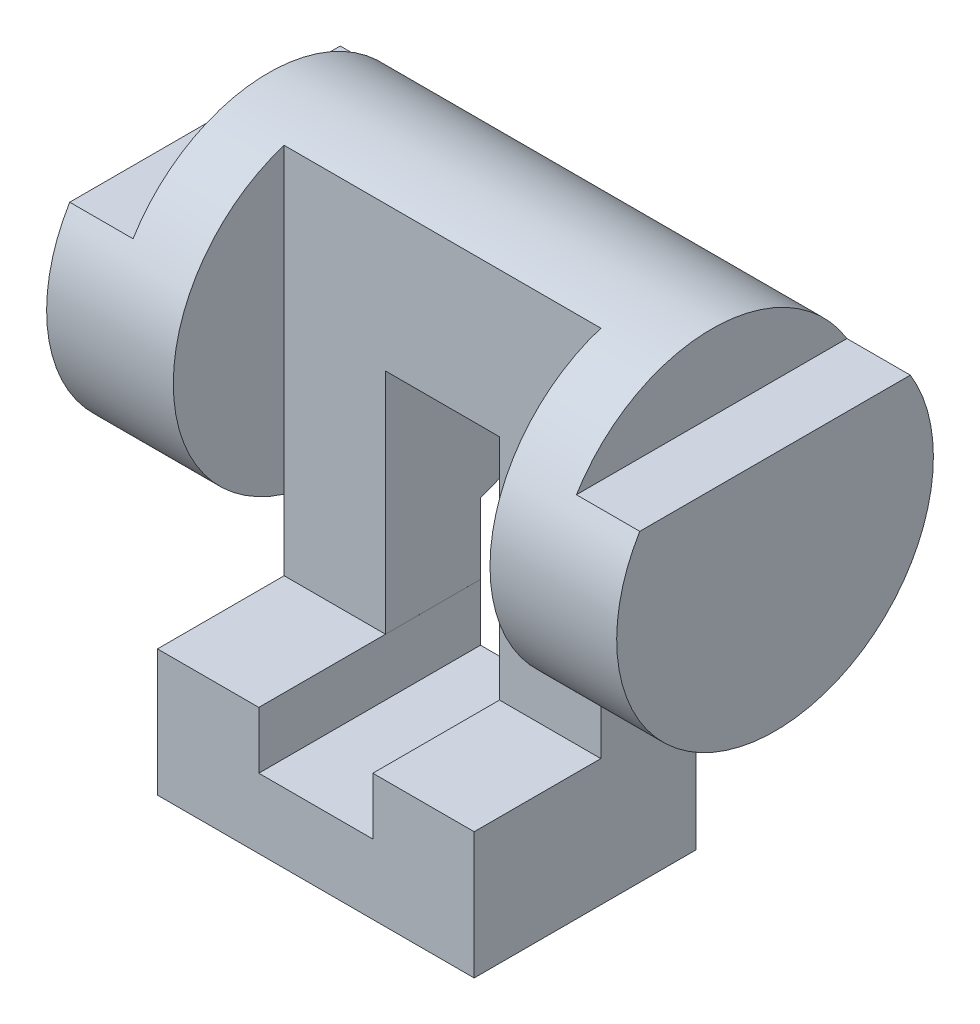
ISO-10303-21;
HEADER;
FILE_DESCRIPTION(('STEP AP214'),'2;1');
FILE_NAME('part.step','',(''),(''),'','','');
FILE_SCHEMA(('AUTOMOTIVE_DESIGN { 1 0 10303 214 1 1 1 1 }'));
ENDSEC;
DATA;
#1=APPLICATION_CONTEXT('core data for automotive mechanical design processes');
#2=APPLICATION_PROTOCOL_DEFINITION('international standard','automotive_design',2000,#1);
#3=PRODUCT_CONTEXT('',#1,'mechanical');
#4=PRODUCT('Part','Part','',(#3));
#5=PRODUCT_RELATED_PRODUCT_CATEGORY('part','',(#4));
#6=PRODUCT_DEFINITION_FORMATION('','',#4);
#7=PRODUCT_DEFINITION_CONTEXT('part definition',#1,'design');
#8=PRODUCT_DEFINITION('design','',#6,#7);
#9=PRODUCT_DEFINITION_SHAPE('','',#8);
#10=(LENGTH_UNIT() NAMED_UNIT(*) SI_UNIT(.MILLI.,.METRE.));
#11=(NAMED_UNIT(*) PLANE_ANGLE_UNIT() SI_UNIT($,.RADIAN.));
#12=(NAMED_UNIT(*) SI_UNIT($,.STERADIAN.) SOLID_ANGLE_UNIT());
#13=UNCERTAINTY_MEASURE_WITH_UNIT(LENGTH_MEASURE(1.E-05),#10,'distance_accuracy_value','');
#14=(GEOMETRIC_REPRESENTATION_CONTEXT(3) GLOBAL_UNCERTAINTY_ASSIGNED_CONTEXT((#13)) GLOBAL_UNIT_ASSIGNED_CONTEXT((#10,
#11,#12)) REPRESENTATION_CONTEXT('',''));
#15=CARTESIAN_POINT('',(0.,0.,0.));
#16=DIRECTION('',(0.,0.,1.));
#17=DIRECTION('',(1.,0.,0.));
#18=AXIS2_PLACEMENT_3D('',#15,#16,#17);
#19=CARTESIAN_POINT('',(0.,0.,-35.));
#20=DIRECTION('',(0.,0.,1.));
#21=DIRECTION('',(1.,0.,0.));
#22=AXIS2_PLACEMENT_3D('',#19,#20,#21);
#23=PLANE('',#22);
#24=DIRECTION('',(-1.,0.,0.));
#25=VECTOR('',#24,1.);
#26=CARTESIAN_POINT('',(70.,31.1515199645764,-35.));
#27=LINE('',#26,#25);
#28=CARTESIAN_POINT('',(16.,31.1515199645764,-35.));
#29=VERTEX_POINT('',#28);
#30=CARTESIAN_POINT('',(0.,31.1515199645764,-35.));
#31=VERTEX_POINT('',#30);
#32=EDGE_CURVE('E200',#29,#31,#27,.T.);
#33=ORIENTED_EDGE('',*,*,#32,.F.);
#34=DIRECTION('',(0.,-1.,0.));
#35=VECTOR('',#34,1.);
#36=CARTESIAN_POINT('',(16.,0.,-35.));
#37=LINE('',#36,#35);
#38=CARTESIAN_POINT('',(16.,20.,-35.));
#39=VERTEX_POINT('',#38);
#40=EDGE_CURVE('E365',#29,#39,#37,.T.);
#41=ORIENTED_EDGE('',*,*,#40,.T.);
#42=DIRECTION('',(-1.,0.,0.));
#43=VECTOR('',#42,1.);
#44=CARTESIAN_POINT('',(50.,20.,-35.));
#45=LINE('',#44,#43);
#46=CARTESIAN_POINT('',(0.,20.,-35.));
#47=VERTEX_POINT('',#46);
#48=EDGE_CURVE('E219',#39,#47,#45,.T.);
#49=ORIENTED_EDGE('',*,*,#48,.T.);
#50=DIRECTION('',(0.,1.,0.));
#51=VECTOR('',#50,1.);
#52=CARTESIAN_POINT('',(0.,0.,-35.));
#53=LINE('',#52,#51);
#54=EDGE_CURVE('E214',#47,#31,#53,.T.);
#55=ORIENTED_EDGE('',*,*,#54,.T.);
#56=EDGE_LOOP('',(#33,#41,#49,#55));
#57=FACE_BOUND('',#56,.T.);
#58=ADVANCED_FACE('F40',(#57),#23,.F.);
#59=DIRECTION('',(0.,-1.,0.));
#60=VECTOR('',#59,1.);
#61=CARTESIAN_POINT('',(34.,11.,-35.));
#62=LINE('',#61,#60);
#63=CARTESIAN_POINT('',(34.,31.1515199645764,-35.));
#64=VERTEX_POINT('',#63);
#65=CARTESIAN_POINT('',(34.,11.,-35.));
#66=VERTEX_POINT('',#65);
#67=EDGE_CURVE('E246',#64,#66,#62,.T.);
#68=ORIENTED_EDGE('',*,*,#67,.F.);
#69=CARTESIAN_POINT('',(50.,31.1515199645764,-35.));
#70=VERTEX_POINT('',#69);
#71=EDGE_CURVE('E208',#70,#64,#27,.T.);
#72=ORIENTED_EDGE('',*,*,#71,.F.);
#73=DIRECTION('',(0.,1.,0.));
#74=VECTOR('',#73,1.);
#75=CARTESIAN_POINT('',(50.,0.,-35.));
#76=LINE('',#75,#74);
#77=CARTESIAN_POINT('',(50.,0.,-35.));
#78=VERTEX_POINT('',#77);
#79=EDGE_CURVE('E243',#78,#70,#76,.T.);
#80=ORIENTED_EDGE('',*,*,#79,.F.);
#81=DIRECTION('',(1.,0.,0.));
#82=VECTOR('',#81,1.);
#83=CARTESIAN_POINT('',(0.,0.,-35.));
#84=LINE('',#83,#82);
#85=CARTESIAN_POINT('',(0.,0.,-35.));
#86=VERTEX_POINT('',#85);
#87=EDGE_CURVE('E239',#86,#78,#84,.T.);
#88=ORIENTED_EDGE('',*,*,#87,.F.);
#89=DIRECTION('',(0.,-1.,0.));
#90=VECTOR('',#89,1.);
#91=CARTESIAN_POINT('',(0.,19.9997012131132,-35.));
#92=LINE('',#91,#90);
#93=CARTESIAN_POINT('',(0.,19.9997012131132,-35.));
#94=VERTEX_POINT('',#93);
#95=EDGE_CURVE('E236',#94,#86,#92,.T.);
#96=ORIENTED_EDGE('',*,*,#95,.F.);
#97=DIRECTION('',(-1.,0.,0.));
#98=VECTOR('',#97,1.);
#99=CARTESIAN_POINT('',(0.,19.9997012131132,-35.));
#100=LINE('',#99,#98);
#101=CARTESIAN_POINT('',(16.,19.9997012131132,-35.));
#102=VERTEX_POINT('',#101);
#103=EDGE_CURVE('E256',#102,#94,#100,.T.);
#104=ORIENTED_EDGE('',*,*,#103,.F.);
#105=DIRECTION('',(0.,1.,0.));
#106=VECTOR('',#105,1.);
#107=CARTESIAN_POINT('',(16.,19.9997012131132,-35.));
#108=LINE('',#107,#106);
#109=CARTESIAN_POINT('',(16.,11.,-35.));
#110=VERTEX_POINT('',#109);
#111=EDGE_CURVE('E253',#110,#102,#108,.T.);
#112=ORIENTED_EDGE('',*,*,#111,.F.);
#113=DIRECTION('',(-1.,0.,0.));
#114=VECTOR('',#113,1.);
#115=CARTESIAN_POINT('',(16.,11.,-35.));
#116=LINE('',#115,#114);
#117=EDGE_CURVE('E250',#66,#110,#116,.T.);
#118=ORIENTED_EDGE('',*,*,#117,.F.);
#119=EDGE_LOOP('',(#68,#72,#80,#88,#96,#104,#112,#118));
#120=FACE_BOUND('',#119,.T.);
#121=ADVANCED_FACE('F457',(#120),#23,.F.);
#122=CARTESIAN_POINT('',(50.,0.,-20.));
#123=DIRECTION('',(0.,0.,1.));
#124=DIRECTION('',(1.,0.,0.));
#125=AXIS2_PLACEMENT_3D('',#122,#123,#124);
#126=PLANE('',#125);
#127=DIRECTION('',(0.,-1.,0.));
#128=VECTOR('',#127,1.);
#129=CARTESIAN_POINT('',(16.,0.,-20.));
#130=LINE('',#129,#128);
#131=CARTESIAN_POINT('',(16.,56.,-20.));
#132=VERTEX_POINT('',#131);
#133=CARTESIAN_POINT('',(16.,20.,-20.));
#134=VERTEX_POINT('',#133);
#135=EDGE_CURVE('E372',#132,#134,#130,.T.);
#136=ORIENTED_EDGE('',*,*,#135,.F.);
#137=DIRECTION('',(-1.,0.,0.));
#138=VECTOR('',#137,1.);
#139=CARTESIAN_POINT('',(50.,56.,-20.));
#140=LINE('',#139,#138);
#141=CARTESIAN_POINT('',(34.,56.,-20.));
#142=VERTEX_POINT('',#141);
#143=EDGE_CURVE('E362',#142,#132,#140,.T.);
#144=ORIENTED_EDGE('',*,*,#143,.F.);
#145=DIRECTION('',(0.,1.,0.));
#146=VECTOR('',#145,1.);
#147=CARTESIAN_POINT('',(34.,0.,-20.));
#148=LINE('',#147,#146);
#149=CARTESIAN_POINT('',(34.,20.,-20.));
#150=VERTEX_POINT('',#149);
#151=EDGE_CURVE('E356',#150,#142,#148,.T.);
#152=ORIENTED_EDGE('',*,*,#151,.F.);
#153=DIRECTION('',(-1.,0.,0.));
#154=VECTOR('',#153,1.);
#155=CARTESIAN_POINT('',(50.,20.,-20.));
#156=LINE('',#155,#154);
#157=CARTESIAN_POINT('',(50.,20.,-20.));
#158=VERTEX_POINT('',#157);
#159=EDGE_CURVE('E231',#158,#150,#156,.T.);
#160=ORIENTED_EDGE('',*,*,#159,.F.);
#161=DIRECTION('',(0.,1.,0.));
#162=VECTOR('',#161,1.);
#163=CARTESIAN_POINT('',(50.,0.,-20.));
#164=LINE('',#163,#162);
#165=CARTESIAN_POINT('',(50.,31.1515199645764,-20.));
#166=VERTEX_POINT('',#165);
#167=EDGE_CURVE('E215',#158,#166,#164,.T.);
#168=ORIENTED_EDGE('',*,*,#167,.T.);
#169=DIRECTION('',(0.,1.,0.));
#170=VECTOR('',#169,1.);
#171=CARTESIAN_POINT('',(50.,20.,-20.));
#172=LINE('',#171,#170);
#173=CARTESIAN_POINT('',(50.,78.8484800354236,-20.));
#174=VERTEX_POINT('',#173);
#175=EDGE_CURVE('E197',#166,#174,#172,.T.);
#176=ORIENTED_EDGE('',*,*,#175,.T.);
#177=DIRECTION('',(-1.,0.,0.));
#178=VECTOR('',#177,1.);
#179=CARTESIAN_POINT('',(70.,78.8484800354236,-20.));
#180=LINE('',#179,#178);
#181=CARTESIAN_POINT('',(0.,78.8484800354236,-20.));
#182=VERTEX_POINT('',#181);
#183=EDGE_CURVE('E306',#174,#182,#180,.T.);
#184=ORIENTED_EDGE('',*,*,#183,.T.);
#185=DIRECTION('',(0.,1.,0.));
#186=VECTOR('',#185,1.);
#187=CARTESIAN_POINT('',(0.,20.,-20.));
#188=LINE('',#187,#186);
#189=CARTESIAN_POINT('',(0.,31.1515199645764,-20.));
#190=VERTEX_POINT('',#189);
#191=EDGE_CURVE('E204',#190,#182,#188,.T.);
#192=ORIENTED_EDGE('',*,*,#191,.F.);
#193=DIRECTION('',(0.,1.,0.));
#194=VECTOR('',#193,1.);
#195=CARTESIAN_POINT('',(0.,0.,-20.));
#196=LINE('',#195,#194);
#197=CARTESIAN_POINT('',(0.,20.,-20.));
#198=VERTEX_POINT('',#197);
#199=EDGE_CURVE('E223',#198,#190,#196,.T.);
#200=ORIENTED_EDGE('',*,*,#199,.F.);
#201=EDGE_CURVE('E230',#134,#198,#156,.T.);
#202=ORIENTED_EDGE('',*,*,#201,.F.);
#203=EDGE_LOOP('',(#136,#144,#152,#160,#168,#176,#184,#192,#200,#202));
#204=FACE_BOUND('',#203,.T.);
#205=ADVANCED_FACE('F384',(#204),#126,.T.);
#206=CARTESIAN_POINT('',(34.,20.,-35.));
#207=DIRECTION('',(0.,1.,0.));
#208=DIRECTION('',(-1.,0.,0.));
#209=AXIS2_PLACEMENT_3D('',#206,#207,#208);
#210=PLANE('',#209);
#211=DIRECTION('',(0.,0.,1.));
#212=VECTOR('',#211,1.);
#213=CARTESIAN_POINT('',(50.,20.,-35.));
#214=LINE('',#213,#212);
#215=CARTESIAN_POINT('',(50.,20.,0.));
#216=VERTEX_POINT('',#215);
#217=EDGE_CURVE('E296',#158,#216,#214,.T.);
#218=ORIENTED_EDGE('',*,*,#217,.F.);
#219=ORIENTED_EDGE('',*,*,#159,.T.);
#220=DIRECTION('',(0.,0.,1.));
#221=VECTOR('',#220,1.);
#222=CARTESIAN_POINT('',(34.,20.,-35.));
#223=LINE('',#222,#221);
#224=CARTESIAN_POINT('',(34.,20.,0.));
#225=VERTEX_POINT('',#224);
#226=EDGE_CURVE('E293',#150,#225,#223,.T.);
#227=ORIENTED_EDGE('',*,*,#226,.T.);
#228=DIRECTION('',(-1.,0.,0.));
#229=VECTOR('',#228,1.);
#230=CARTESIAN_POINT('',(34.,20.,0.));
#231=LINE('',#230,#229);
#232=EDGE_CURVE('E268',#216,#225,#231,.T.);
#233=ORIENTED_EDGE('',*,*,#232,.F.);
#234=EDGE_LOOP('',(#218,#219,#227,#233));
#235=FACE_BOUND('',#234,.T.);
#236=ADVANCED_FACE('F438',(#235),#210,.T.);
#237=CARTESIAN_POINT('',(0.,19.9997012131132,-35.));
#238=DIRECTION('',(-1.,0.,0.));
#239=DIRECTION('',(0.,0.,1.));
#240=AXIS2_PLACEMENT_3D('',#237,#238,#239);
#241=PLANE('',#240);
#242=DIRECTION('',(0.,-1.,0.));
#243=VECTOR('',#242,1.);
#244=CARTESIAN_POINT('',(0.,19.9997012131132,0.));
#245=LINE('',#244,#243);
#246=CARTESIAN_POINT('',(0.,19.9997012131132,0.));
#247=VERTEX_POINT('',#246);
#248=CARTESIAN_POINT('',(0.,0.,0.));
#249=VERTEX_POINT('',#248);
#250=EDGE_CURVE('E235',#247,#249,#245,.T.);
#251=ORIENTED_EDGE('',*,*,#250,.F.);
#252=DIRECTION('',(0.,0.,1.));
#253=VECTOR('',#252,1.);
#254=CARTESIAN_POINT('',(0.,19.9997012131132,-35.));
#255=LINE('',#254,#253);
#256=EDGE_CURVE('E283',#94,#247,#255,.T.);
#257=ORIENTED_EDGE('',*,*,#256,.F.);
#258=ORIENTED_EDGE('',*,*,#95,.T.);
#259=DIRECTION('',(0.,0.,1.));
#260=VECTOR('',#259,1.);
#261=CARTESIAN_POINT('',(0.,0.,-35.));
#262=LINE('',#261,#260);
#263=EDGE_CURVE('E259',#86,#249,#262,.T.);
#264=ORIENTED_EDGE('',*,*,#263,.T.);
#265=EDGE_LOOP('',(#251,#257,#258,#264));
#266=FACE_BOUND('',#265,.T.);
#267=ADVANCED_FACE('F42',(#266),#241,.T.);
#268=CARTESIAN_POINT('',(0.,19.9997012131132,-35.));
#269=DIRECTION('',(0.,1.,0.));
#270=DIRECTION('',(0.,0.,1.));
#271=AXIS2_PLACEMENT_3D('',#268,#269,#270);
#272=PLANE('',#271);
#273=DIRECTION('',(-1.,0.,0.));
#274=VECTOR('',#273,1.);
#275=CARTESIAN_POINT('',(0.,19.9997012131132,0.));
#276=LINE('',#275,#274);
#277=CARTESIAN_POINT('',(16.,19.9997012131132,0.));
#278=VERTEX_POINT('',#277);
#279=EDGE_CURVE('E240',#278,#247,#276,.T.);
#280=ORIENTED_EDGE('',*,*,#279,.F.);
#281=DIRECTION('',(0.,0.,1.));
#282=VECTOR('',#281,1.);
#283=CARTESIAN_POINT('',(16.,19.9997012131132,-35.));
#284=LINE('',#283,#282);
#285=EDGE_CURVE('E286',#102,#278,#284,.T.);
#286=ORIENTED_EDGE('',*,*,#285,.F.);
#287=ORIENTED_EDGE('',*,*,#103,.T.);
#288=ORIENTED_EDGE('',*,*,#256,.T.);
#289=EDGE_LOOP('',(#280,#286,#287,#288));
#290=FACE_BOUND('',#289,.T.);
#291=ADVANCED_FACE('F471',(#290),#272,.T.);
#292=CARTESIAN_POINT('',(16.,19.9997012131132,-35.));
#293=DIRECTION('',(1.,0.,0.));
#294=DIRECTION('',(0.,0.,-1.));
#295=AXIS2_PLACEMENT_3D('',#292,#293,#294);
#296=PLANE('',#295);
#297=DIRECTION('',(0.,1.,0.));
#298=VECTOR('',#297,1.);
#299=CARTESIAN_POINT('',(16.,19.9997012131132,0.));
#300=LINE('',#299,#298);
#301=CARTESIAN_POINT('',(16.,11.,0.));
#302=VERTEX_POINT('',#301);
#303=EDGE_CURVE('E278',#302,#278,#300,.T.);
#304=ORIENTED_EDGE('',*,*,#303,.F.);
#305=DIRECTION('',(0.,0.,1.));
#306=VECTOR('',#305,1.);
#307=CARTESIAN_POINT('',(16.,11.,-35.));
#308=LINE('',#307,#306);
#309=EDGE_CURVE('E288',#110,#302,#308,.T.);
#310=ORIENTED_EDGE('',*,*,#309,.F.);
#311=ORIENTED_EDGE('',*,*,#111,.T.);
#312=ORIENTED_EDGE('',*,*,#285,.T.);
#313=EDGE_LOOP('',(#304,#310,#311,#312));
#314=FACE_BOUND('',#313,.T.);
#315=ADVANCED_FACE('F474',(#314),#296,.T.);
#316=CARTESIAN_POINT('',(16.,11.,-35.));
#317=DIRECTION('',(0.,1.,0.));
#318=DIRECTION('',(0.,0.,1.));
#319=AXIS2_PLACEMENT_3D('',#316,#317,#318);
#320=PLANE('',#319);
#321=DIRECTION('',(-1.,0.,0.));
#322=VECTOR('',#321,1.);
#323=CARTESIAN_POINT('',(16.,11.,0.));
#324=LINE('',#323,#322);
#325=CARTESIAN_POINT('',(34.,11.,0.));
#326=VERTEX_POINT('',#325);
#327=EDGE_CURVE('E275',#326,#302,#324,.T.);
#328=ORIENTED_EDGE('',*,*,#327,.F.);
#329=DIRECTION('',(0.,0.,1.));
#330=VECTOR('',#329,1.);
#331=CARTESIAN_POINT('',(34.,11.,-35.));
#332=LINE('',#331,#330);
#333=EDGE_CURVE('E290',#66,#326,#332,.T.);
#334=ORIENTED_EDGE('',*,*,#333,.F.);
#335=ORIENTED_EDGE('',*,*,#117,.T.);
#336=ORIENTED_EDGE('',*,*,#309,.T.);
#337=EDGE_LOOP('',(#328,#334,#335,#336));
#338=FACE_BOUND('',#337,.T.);
#339=ADVANCED_FACE('F478',(#338),#320,.T.);
#340=CARTESIAN_POINT('',(34.,11.,-35.));
#341=DIRECTION('',(-1.,0.,0.));
#342=DIRECTION('',(0.,0.,1.));
#343=AXIS2_PLACEMENT_3D('',#340,#341,#342);
#344=PLANE('',#343);
#345=DIRECTION('',(0.,-1.,0.));
#346=VECTOR('',#345,1.);
#347=CARTESIAN_POINT('',(34.,11.,0.));
#348=LINE('',#347,#346);
#349=EDGE_CURVE('E271',#225,#326,#348,.T.);
#350=ORIENTED_EDGE('',*,*,#349,.F.);
#351=ORIENTED_EDGE('',*,*,#226,.F.);
#352=ORIENTED_EDGE('',*,*,#151,.T.);
#353=DIRECTION('',(0.,0.,1.));
#354=VECTOR('',#353,1.);
#355=CARTESIAN_POINT('',(34.,56.,-60.));
#356=LINE('',#355,#354);
#357=CARTESIAN_POINT('',(34.,56.,-52.4799919935936));
#358=VERTEX_POINT('',#357);
#359=EDGE_CURVE('E351',#358,#142,#356,.T.);
#360=ORIENTED_EDGE('',*,*,#359,.F.);
#361=CARTESIAN_POINT('',(34.,55.,-27.5));
#362=DIRECTION('',(1.,0.,0.));
#363=DIRECTION('',(0.,0.,-1.));
#364=AXIS2_PLACEMENT_3D('',#361,#362,#363);
#365=CIRCLE('',#364,25.);
#366=EDGE_CURVE('E314',#64,#358,#365,.T.);
#367=ORIENTED_EDGE('',*,*,#366,.F.);
#368=ORIENTED_EDGE('',*,*,#67,.T.);
#369=ORIENTED_EDGE('',*,*,#333,.T.);
#370=EDGE_LOOP('',(#350,#351,#352,#360,#367,#368,#369));
#371=FACE_BOUND('',#370,.T.);
#372=ADVANCED_FACE('F433',(#371),#344,.T.);
#373=CARTESIAN_POINT('',(50.,0.,-35.));
#374=DIRECTION('',(1.,0.,0.));
#375=DIRECTION('',(0.,1.,0.));
#376=AXIS2_PLACEMENT_3D('',#373,#374,#375);
#377=PLANE('',#376);
#378=ORIENTED_EDGE('',*,*,#79,.T.);
#379=CARTESIAN_POINT('',(50.,55.,-27.5));
#380=DIRECTION('',(1.,0.,0.));
#381=DIRECTION('',(0.,1.,0.));
#382=AXIS2_PLACEMENT_3D('',#379,#380,#381);
#383=CIRCLE('',#382,25.);
#384=EDGE_CURVE('E211',#70,#166,#383,.F.);
#385=ORIENTED_EDGE('',*,*,#384,.T.);
#386=ORIENTED_EDGE('',*,*,#167,.F.);
#387=ORIENTED_EDGE('',*,*,#217,.T.);
#388=DIRECTION('',(0.,1.,0.));
#389=VECTOR('',#388,1.);
#390=CARTESIAN_POINT('',(50.,0.,0.));
#391=LINE('',#390,#389);
#392=CARTESIAN_POINT('',(50.,0.,0.));
#393=VERTEX_POINT('',#392);
#394=EDGE_CURVE('E265',#393,#216,#391,.T.);
#395=ORIENTED_EDGE('',*,*,#394,.F.);
#396=DIRECTION('',(0.,0.,1.));
#397=VECTOR('',#396,1.);
#398=CARTESIAN_POINT('',(50.,0.,-35.));
#399=LINE('',#398,#397);
#400=EDGE_CURVE('E298',#78,#393,#399,.T.);
#401=ORIENTED_EDGE('',*,*,#400,.F.);
#402=EDGE_LOOP('',(#378,#385,#386,#387,#395,#401));
#403=FACE_BOUND('',#402,.T.);
#404=ADVANCED_FACE('F442',(#403),#377,.T.);
#405=CARTESIAN_POINT('',(0.,0.,-35.));
#406=DIRECTION('',(0.,-1.,0.));
#407=DIRECTION('',(0.,0.,-1.));
#408=AXIS2_PLACEMENT_3D('',#405,#406,#407);
#409=PLANE('',#408);
#410=DIRECTION('',(1.,0.,0.));
#411=VECTOR('',#410,1.);
#412=CARTESIAN_POINT('',(0.,0.,0.));
#413=LINE('',#412,#411);
#414=EDGE_CURVE('E262',#249,#393,#413,.T.);
#415=ORIENTED_EDGE('',*,*,#414,.F.);
#416=ORIENTED_EDGE('',*,*,#263,.F.);
#417=ORIENTED_EDGE('',*,*,#87,.T.);
#418=ORIENTED_EDGE('',*,*,#400,.T.);
#419=EDGE_LOOP('',(#415,#416,#417,#418));
#420=FACE_BOUND('',#419,.T.);
#421=ADVANCED_FACE('F469',(#420),#409,.T.);
#422=CARTESIAN_POINT('',(0.,0.,0.));
#423=DIRECTION('',(0.,0.,1.));
#424=DIRECTION('',(1.,0.,0.));
#425=AXIS2_PLACEMENT_3D('',#422,#423,#424);
#426=PLANE('',#425);
#427=ORIENTED_EDGE('',*,*,#250,.T.);
#428=ORIENTED_EDGE('',*,*,#414,.T.);
#429=ORIENTED_EDGE('',*,*,#394,.T.);
#430=ORIENTED_EDGE('',*,*,#232,.T.);
#431=ORIENTED_EDGE('',*,*,#349,.T.);
#432=ORIENTED_EDGE('',*,*,#327,.T.);
#433=ORIENTED_EDGE('',*,*,#303,.T.);
#434=ORIENTED_EDGE('',*,*,#279,.T.);
#435=EDGE_LOOP('',(#427,#428,#429,#430,#431,#432,#433,#434));
#436=FACE_BOUND('',#435,.T.);
#437=ADVANCED_FACE('F466',(#436),#426,.T.);
#438=CARTESIAN_POINT('',(50.,20.,0.));
#439=DIRECTION('',(0.,-1.,0.));
#440=DIRECTION('',(0.,0.,-1.));
#441=AXIS2_PLACEMENT_3D('',#438,#439,#440);
#442=PLANE('',#441);
#443=DIRECTION('',(0.,0.,-1.));
#444=VECTOR('',#443,1.);
#445=CARTESIAN_POINT('',(16.,20.,0.));
#446=LINE('',#445,#444);
#447=EDGE_CURVE('E369',#134,#39,#446,.T.);
#448=ORIENTED_EDGE('',*,*,#447,.F.);
#449=ORIENTED_EDGE('',*,*,#201,.T.);
#450=DIRECTION('',(0.,0.,1.));
#451=VECTOR('',#450,1.);
#452=CARTESIAN_POINT('',(0.,20.,0.));
#453=LINE('',#452,#451);
#454=EDGE_CURVE('E220',#47,#198,#453,.T.);
#455=ORIENTED_EDGE('',*,*,#454,.F.);
#456=ORIENTED_EDGE('',*,*,#48,.F.);
#457=EDGE_LOOP('',(#448,#449,#455,#456));
#458=FACE_BOUND('',#457,.T.);
#459=ADVANCED_FACE('F395',(#458),#442,.T.);
#460=CARTESIAN_POINT('',(0.,0.,0.));
#461=DIRECTION('',(1.,0.,0.));
#462=DIRECTION('',(0.,0.,-1.));
#463=AXIS2_PLACEMENT_3D('',#460,#461,#462);
#464=PLANE('',#463);
#465=CARTESIAN_POINT('',(0.,55.,-27.5));
#466=DIRECTION('',(1.,0.,0.));
#467=DIRECTION('',(0.,0.,-1.));
#468=AXIS2_PLACEMENT_3D('',#465,#466,#467);
#469=CIRCLE('',#468,25.);
#470=EDGE_CURVE('E285',#31,#190,#469,.F.);
#471=ORIENTED_EDGE('',*,*,#470,.F.);
#472=ORIENTED_EDGE('',*,*,#54,.F.);
#473=ORIENTED_EDGE('',*,*,#454,.T.);
#474=ORIENTED_EDGE('',*,*,#199,.T.);
#475=EDGE_LOOP('',(#471,#472,#473,#474));
#476=FACE_BOUND('',#475,.T.);
#477=ADVANCED_FACE('F389',(#476),#464,.F.);
#478=CARTESIAN_POINT('',(70.,55.,-27.5));
#479=DIRECTION('',(-1.,0.,0.));
#480=DIRECTION('',(0.,0.,1.));
#481=AXIS2_PLACEMENT_3D('',#478,#479,#480);
#482=CYLINDRICAL_SURFACE('',#481,25.);
#483=CARTESIAN_POINT('',(70.,55.,-27.5));
#484=DIRECTION('',(1.,0.,0.));
#485=DIRECTION('',(0.,0.,-1.));
#486=AXIS2_PLACEMENT_3D('',#483,#484,#485);
#487=CIRCLE('',#486,25.);
#488=CARTESIAN_POINT('',(70.,68.,-6.14584349593738));
#489=VERTEX_POINT('',#488);
#490=CARTESIAN_POINT('',(70.,68.,-48.8541565040626));
#491=VERTEX_POINT('',#490);
#492=EDGE_CURVE('E196',#489,#491,#487,.T.);
#493=ORIENTED_EDGE('',*,*,#492,.F.);
#494=DIRECTION('',(-1.,0.,0.));
#495=VECTOR('',#494,1.);
#496=CARTESIAN_POINT('',(70.,68.,-6.14584349593738));
#497=LINE('',#496,#495);
#498=CARTESIAN_POINT('',(60.,68.,-6.14584349593738));
#499=VERTEX_POINT('',#498);
#500=EDGE_CURVE('E56',#489,#499,#497,.T.);
#501=ORIENTED_EDGE('',*,*,#500,.T.);
#502=CARTESIAN_POINT('',(60.,55.,-27.5));
#503=DIRECTION('',(-1.,0.,0.));
#504=DIRECTION('',(0.,0.,1.));
#505=AXIS2_PLACEMENT_3D('',#502,#503,#504);
#506=CIRCLE('',#505,25.);
#507=CARTESIAN_POINT('',(60.,68.,-48.8541565040626));
#508=VERTEX_POINT('',#507);
#509=EDGE_CURVE('E49',#499,#508,#506,.T.);
#510=ORIENTED_EDGE('',*,*,#509,.T.);
#511=DIRECTION('',(-1.,0.,0.));
#512=VECTOR('',#511,1.);
#513=CARTESIAN_POINT('',(70.,68.,-48.8541565040626));
#514=LINE('',#513,#512);
#515=EDGE_CURVE('E193',#508,#491,#514,.F.);
#516=ORIENTED_EDGE('',*,*,#515,.T.);
#517=EDGE_LOOP('',(#493,#501,#510,#516));
#518=FACE_BOUND('',#517,.T.);
#519=DIRECTION('',(-1.,0.,0.));
#520=VECTOR('',#519,1.);
#521=CARTESIAN_POINT('',(70.,56.,-52.4799919935936));
#522=LINE('',#521,#520);
#523=CARTESIAN_POINT('',(16.,56.,-52.4799919935936));
#524=VERTEX_POINT('',#523);
#525=EDGE_CURVE('E318',#358,#524,#522,.T.);
#526=ORIENTED_EDGE('',*,*,#525,.T.);
#527=CARTESIAN_POINT('',(16.,55.,-27.5));
#528=DIRECTION('',(-1.,0.,0.));
#529=DIRECTION('',(0.,-1.,0.));
#530=AXIS2_PLACEMENT_3D('',#527,#528,#529);
#531=CIRCLE('',#530,25.);
#532=EDGE_CURVE('E187',#524,#29,#531,.T.);
#533=ORIENTED_EDGE('',*,*,#532,.T.);
#534=ORIENTED_EDGE('',*,*,#32,.T.);
#535=ORIENTED_EDGE('',*,*,#470,.T.);
#536=CARTESIAN_POINT('',(0.,55.,-27.5));
#537=DIRECTION('',(1.,0.,0.));
#538=DIRECTION('',(0.,0.,-1.));
#539=AXIS2_PLACEMENT_3D('',#536,#537,#538);
#540=CIRCLE('',#539,25.);
#541=EDGE_CURVE('E303',#182,#190,#540,.T.);
#542=ORIENTED_EDGE('',*,*,#541,.F.);
#543=ORIENTED_EDGE('',*,*,#183,.F.);
#544=CARTESIAN_POINT('',(50.,55.,-27.5));
#545=DIRECTION('',(1.,0.,0.));
#546=DIRECTION('',(0.,0.,-1.));
#547=AXIS2_PLACEMENT_3D('',#544,#545,#546);
#548=CIRCLE('',#547,25.);
#549=EDGE_CURVE('E310',#174,#166,#548,.T.);
#550=ORIENTED_EDGE('',*,*,#549,.T.);
#551=ORIENTED_EDGE('',*,*,#384,.F.);
#552=ORIENTED_EDGE('',*,*,#71,.T.);
#553=ORIENTED_EDGE('',*,*,#366,.T.);
#554=EDGE_LOOP('',(#526,#533,#534,#535,#542,#543,#550,#551,#552,#553));
#555=FACE_BOUND('',#554,.T.);
#556=CARTESIAN_POINT('',(-9.99999999999994,55.,-27.5));
#557=DIRECTION('',(1.,0.,0.));
#558=DIRECTION('',(0.,0.,-1.));
#559=AXIS2_PLACEMENT_3D('',#556,#557,#558);
#560=CIRCLE('',#559,25.);
#561=CARTESIAN_POINT('',(-9.99999999999993,68.,-48.8541565040626));
#562=VERTEX_POINT('',#561);
#563=CARTESIAN_POINT('',(-9.99999999999993,68.,-6.14584349593738));
#564=VERTEX_POINT('',#563);
#565=EDGE_CURVE('E11',#562,#564,#560,.T.);
#566=ORIENTED_EDGE('',*,*,#565,.T.);
#567=DIRECTION('',(-1.,0.,0.));
#568=VECTOR('',#567,1.);
#569=CARTESIAN_POINT('',(70.,68.,-6.14584349593738));
#570=LINE('',#569,#568);
#571=CARTESIAN_POINT('',(-20.,68.,-6.14584349593737));
#572=VERTEX_POINT('',#571);
#573=EDGE_CURVE('E180',#564,#572,#570,.T.);
#574=ORIENTED_EDGE('',*,*,#573,.T.);
#575=CARTESIAN_POINT('',(-20.,55.,-27.5));
#576=DIRECTION('',(1.,0.,0.));
#577=DIRECTION('',(0.,0.,-1.));
#578=AXIS2_PLACEMENT_3D('',#575,#576,#577);
#579=CIRCLE('',#578,25.);
#580=CARTESIAN_POINT('',(-20.,68.,-48.8541565040626));
#581=VERTEX_POINT('',#580);
#582=EDGE_CURVE('E191',#572,#581,#579,.T.);
#583=ORIENTED_EDGE('',*,*,#582,.T.);
#584=DIRECTION('',(-1.,0.,0.));
#585=VECTOR('',#584,1.);
#586=CARTESIAN_POINT('',(70.,68.,-48.8541565040626));
#587=LINE('',#586,#585);
#588=EDGE_CURVE('E64',#581,#562,#587,.F.);
#589=ORIENTED_EDGE('',*,*,#588,.T.);
#590=EDGE_LOOP('',(#566,#574,#583,#589));
#591=FACE_BOUND('',#590,.T.);
#592=ADVANCED_FACE('F190',(#518,#555,#591),#482,.T.);
#593=CARTESIAN_POINT('',(70.,0.,0.));
#594=DIRECTION('',(1.,0.,0.));
#595=DIRECTION('',(0.,0.,-1.));
#596=AXIS2_PLACEMENT_3D('',#593,#594,#595);
#597=PLANE('',#596);
#598=DIRECTION('',(0.,0.,-1.));
#599=VECTOR('',#598,1.);
#600=CARTESIAN_POINT('',(70.,68.,0.));
#601=LINE('',#600,#599);
#602=EDGE_CURVE('E186',#489,#491,#601,.T.);
#603=ORIENTED_EDGE('',*,*,#602,.F.);
#604=ORIENTED_EDGE('',*,*,#492,.T.);
#605=EDGE_LOOP('',(#603,#604));
#606=FACE_BOUND('',#605,.T.);
#607=ADVANCED_FACE('F453',(#606),#597,.T.);
#608=CARTESIAN_POINT('',(-20.,0.,0.));
#609=DIRECTION('',(1.,0.,0.));
#610=DIRECTION('',(0.,0.,-1.));
#611=AXIS2_PLACEMENT_3D('',#608,#609,#610);
#612=PLANE('',#611);
#613=ORIENTED_EDGE('',*,*,#582,.F.);
#614=DIRECTION('',(0.,0.,-1.));
#615=VECTOR('',#614,1.);
#616=CARTESIAN_POINT('',(-20.,68.,0.));
#617=LINE('',#616,#615);
#618=EDGE_CURVE('E177',#572,#581,#617,.T.);
#619=ORIENTED_EDGE('',*,*,#618,.T.);
#620=EDGE_LOOP('',(#613,#619));
#621=FACE_BOUND('',#620,.T.);
#622=ADVANCED_FACE('F195',(#621),#612,.F.);
#623=CARTESIAN_POINT('',(50.,0.,0.));
#624=DIRECTION('',(1.,0.,0.));
#625=DIRECTION('',(0.,0.,-1.));
#626=AXIS2_PLACEMENT_3D('',#623,#624,#625);
#627=PLANE('',#626);
#628=ORIENTED_EDGE('',*,*,#175,.F.);
#629=ORIENTED_EDGE('',*,*,#549,.F.);
#630=EDGE_LOOP('',(#628,#629));
#631=FACE_BOUND('',#630,.T.);
#632=ADVANCED_FACE('F445',(#631),#627,.F.);
#633=CARTESIAN_POINT('',(0.,0.,0.));
#634=DIRECTION('',(1.,0.,0.));
#635=DIRECTION('',(0.,0.,-1.));
#636=AXIS2_PLACEMENT_3D('',#633,#634,#635);
#637=PLANE('',#636);
#638=ORIENTED_EDGE('',*,*,#541,.T.);
#639=ORIENTED_EDGE('',*,*,#191,.T.);
#640=EDGE_LOOP('',(#638,#639));
#641=FACE_BOUND('',#640,.T.);
#642=ADVANCED_FACE('F378',(#641),#637,.T.);
#643=CARTESIAN_POINT('',(34.,56.,-60.));
#644=DIRECTION('',(0.,1.,0.));
#645=DIRECTION('',(0.,0.,1.));
#646=AXIS2_PLACEMENT_3D('',#643,#644,#645);
#647=PLANE('',#646);
#648=ORIENTED_EDGE('',*,*,#143,.T.);
#649=DIRECTION('',(0.,0.,1.));
#650=VECTOR('',#649,1.);
#651=CARTESIAN_POINT('',(16.,56.,-60.));
#652=LINE('',#651,#650);
#653=EDGE_CURVE('E352',#524,#132,#652,.T.);
#654=ORIENTED_EDGE('',*,*,#653,.F.);
#655=ORIENTED_EDGE('',*,*,#525,.F.);
#656=ORIENTED_EDGE('',*,*,#359,.T.);
#657=EDGE_LOOP('',(#648,#654,#655,#656));
#658=FACE_BOUND('',#657,.T.);
#659=ADVANCED_FACE('F428',(#658),#647,.F.);
#660=CARTESIAN_POINT('',(16.,56.,-60.));
#661=DIRECTION('',(-1.,0.,0.));
#662=DIRECTION('',(0.,-1.,0.));
#663=AXIS2_PLACEMENT_3D('',#660,#661,#662);
#664=PLANE('',#663);
#665=ORIENTED_EDGE('',*,*,#135,.T.);
#666=ORIENTED_EDGE('',*,*,#447,.T.);
#667=ORIENTED_EDGE('',*,*,#40,.F.);
#668=ORIENTED_EDGE('',*,*,#532,.F.);
#669=ORIENTED_EDGE('',*,*,#653,.T.);
#670=EDGE_LOOP('',(#665,#666,#667,#668,#669));
#671=FACE_BOUND('',#670,.T.);
#672=ADVANCED_FACE('F424',(#671),#664,.F.);
#673=CARTESIAN_POINT('',(-9.99999999999993,68.,-60.));
#674=DIRECTION('',(1.,0.,0.));
#675=DIRECTION('',(0.,0.,-1.));
#676=AXIS2_PLACEMENT_3D('',#673,#674,#675);
#677=PLANE('',#676);
#678=DIRECTION('',(0.,0.,1.));
#679=VECTOR('',#678,1.);
#680=CARTESIAN_POINT('',(-9.99999999999993,68.,-60.));
#681=LINE('',#680,#679);
#682=EDGE_CURVE('E339',#562,#564,#681,.T.);
#683=ORIENTED_EDGE('',*,*,#682,.T.);
#684=ORIENTED_EDGE('',*,*,#565,.F.);
#685=EDGE_LOOP('',(#683,#684));
#686=FACE_BOUND('',#685,.T.);
#687=ADVANCED_FACE('F619',(#686),#677,.F.);
#688=CARTESIAN_POINT('',(-20.,68.,-60.));
#689=DIRECTION('',(0.,-1.,0.));
#690=DIRECTION('',(0.,0.,-1.));
#691=AXIS2_PLACEMENT_3D('',#688,#689,#690);
#692=PLANE('',#691);
#693=ORIENTED_EDGE('',*,*,#682,.F.);
#694=ORIENTED_EDGE('',*,*,#588,.F.);
#695=ORIENTED_EDGE('',*,*,#618,.F.);
#696=ORIENTED_EDGE('',*,*,#573,.F.);
#697=EDGE_LOOP('',(#693,#694,#695,#696));
#698=FACE_BOUND('',#697,.T.);
#699=ADVANCED_FACE('F179',(#698),#692,.F.);
#700=CARTESIAN_POINT('',(60.,68.,-60.));
#701=DIRECTION('',(-1.,0.,0.));
#702=DIRECTION('',(0.,0.,1.));
#703=AXIS2_PLACEMENT_3D('',#700,#701,#702);
#704=PLANE('',#703);
#705=DIRECTION('',(0.,0.,1.));
#706=VECTOR('',#705,1.);
#707=CARTESIAN_POINT('',(60.,68.,-60.));
#708=LINE('',#707,#706);
#709=EDGE_CURVE('E337',#508,#499,#708,.T.);
#710=ORIENTED_EDGE('',*,*,#709,.F.);
#711=ORIENTED_EDGE('',*,*,#509,.F.);
#712=EDGE_LOOP('',(#710,#711));
#713=FACE_BOUND('',#712,.T.);
#714=ADVANCED_FACE('F336',(#713),#704,.F.);
#715=CARTESIAN_POINT('',(70.,68.,-60.));
#716=DIRECTION('',(0.,-1.,0.));
#717=DIRECTION('',(0.,0.,-1.));
#718=AXIS2_PLACEMENT_3D('',#715,#716,#717);
#719=PLANE('',#718);
#720=ORIENTED_EDGE('',*,*,#602,.T.);
#721=ORIENTED_EDGE('',*,*,#515,.F.);
#722=ORIENTED_EDGE('',*,*,#709,.T.);
#723=ORIENTED_EDGE('',*,*,#500,.F.);
#724=EDGE_LOOP('',(#720,#721,#722,#723));
#725=FACE_BOUND('',#724,.T.);
#726=ADVANCED_FACE('F338',(#725),#719,.F.);
#727=CLOSED_SHELL('',(#58,#121,#205,#236,#267,#291,#315,#339,#372,#404,#421,#437,#459,#477,#592,
#607,#622,#632,#642,#659,#672,#687,#699,#714,#726));
#728=MANIFOLD_SOLID_BREP('B2',#727);
#729=ADVANCED_BREP_SHAPE_REPRESENTATION('',(#18,#728),#14);
#730=SHAPE_DEFINITION_REPRESENTATION(#9,#729);
ENDSEC;
END-ISO-10303-21;
